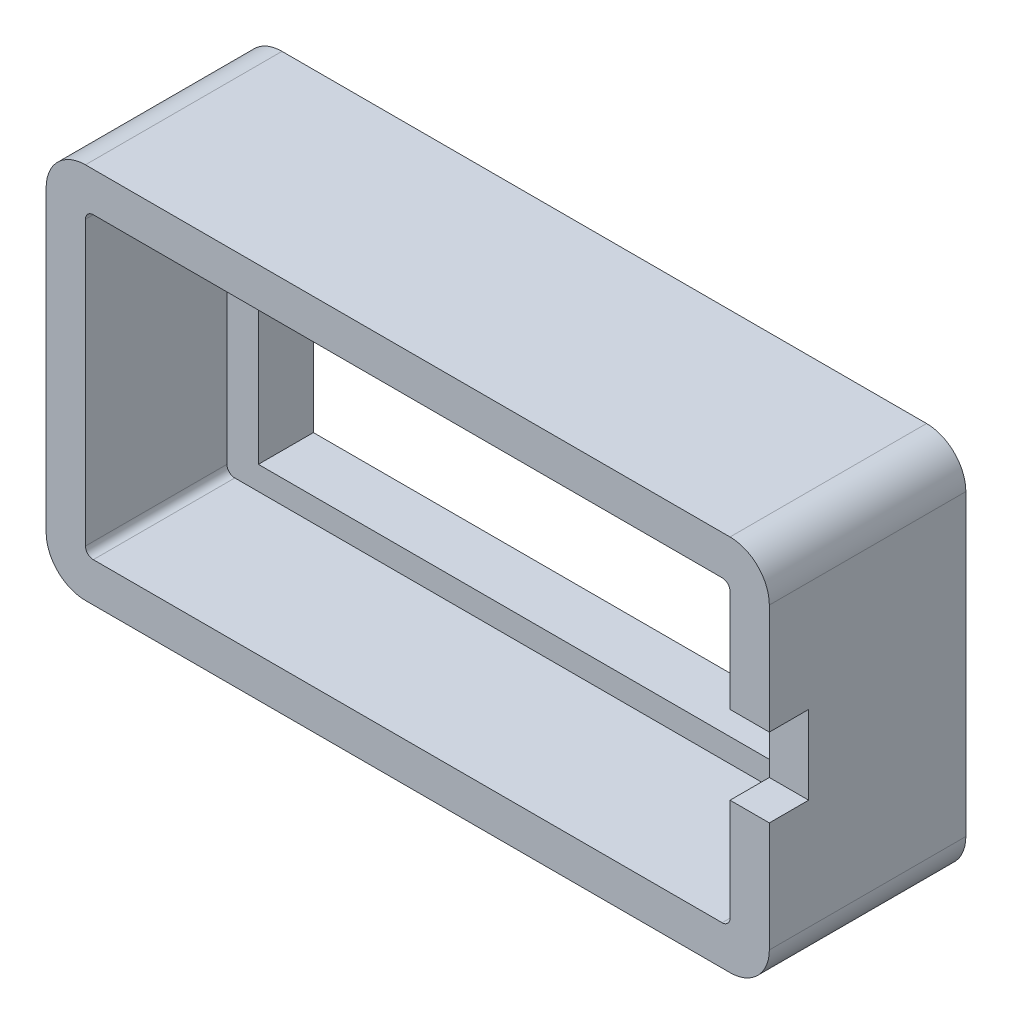
ISO-10303-21;
HEADER;
FILE_DESCRIPTION(('STEP AP214'),'2;1');
FILE_NAME('part.step','',(''),(''),'','','');
FILE_SCHEMA(('AUTOMOTIVE_DESIGN { 1 0 10303 214 1 1 1 1 }'));
ENDSEC;
DATA;
#1=APPLICATION_CONTEXT('core data for automotive mechanical design processes');
#2=APPLICATION_PROTOCOL_DEFINITION('international standard','automotive_design',2000,#1);
#3=PRODUCT_CONTEXT('',#1,'mechanical');
#4=PRODUCT('Part','Part','',(#3));
#5=PRODUCT_RELATED_PRODUCT_CATEGORY('part','',(#4));
#6=PRODUCT_DEFINITION_FORMATION('','',#4);
#7=PRODUCT_DEFINITION_CONTEXT('part definition',#1,'design');
#8=PRODUCT_DEFINITION('design','',#6,#7);
#9=PRODUCT_DEFINITION_SHAPE('','',#8);
#10=(LENGTH_UNIT() NAMED_UNIT(*) SI_UNIT(.MILLI.,.METRE.));
#11=(NAMED_UNIT(*) PLANE_ANGLE_UNIT() SI_UNIT($,.RADIAN.));
#12=(NAMED_UNIT(*) SI_UNIT($,.STERADIAN.) SOLID_ANGLE_UNIT());
#13=UNCERTAINTY_MEASURE_WITH_UNIT(LENGTH_MEASURE(1.E-05),#10,'distance_accuracy_value','');
#14=(GEOMETRIC_REPRESENTATION_CONTEXT(3) GLOBAL_UNCERTAINTY_ASSIGNED_CONTEXT((#13)) GLOBAL_UNIT_ASSIGNED_CONTEXT((#10,
#11,#12)) REPRESENTATION_CONTEXT('',''));
#15=CARTESIAN_POINT('',(0.,0.,0.));
#16=DIRECTION('',(0.,0.,1.));
#17=DIRECTION('',(1.,0.,0.));
#18=AXIS2_PLACEMENT_3D('',#15,#16,#17);
#19=CARTESIAN_POINT('',(0.,0.,25.));
#20=DIRECTION('',(1.,0.,0.));
#21=DIRECTION('',(0.,1.,0.));
#22=AXIS2_PLACEMENT_3D('',#19,#20,#21);
#23=PLANE('',#22);
#24=DIRECTION('',(0.,0.,-1.));
#25=VECTOR('',#24,1.);
#26=CARTESIAN_POINT('',(0.,0.,25.));
#27=LINE('',#26,#25);
#28=CARTESIAN_POINT('',(0.,0.,7.));
#29=VERTEX_POINT('',#28);
#30=CARTESIAN_POINT('',(0.,0.,0.));
#31=VERTEX_POINT('',#30);
#32=EDGE_CURVE('E268',#29,#31,#27,.T.);
#33=ORIENTED_EDGE('',*,*,#32,.F.);
#34=DIRECTION('',(0.,-1.,0.));
#35=VECTOR('',#34,1.);
#36=CARTESIAN_POINT('',(0.,0.,7.));
#37=LINE('',#36,#35);
#38=CARTESIAN_POINT('',(0.,-29.,7.));
#39=VERTEX_POINT('',#38);
#40=EDGE_CURVE('E253',#29,#39,#37,.T.);
#41=ORIENTED_EDGE('',*,*,#40,.T.);
#42=DIRECTION('',(0.,0.,-1.));
#43=VECTOR('',#42,1.);
#44=CARTESIAN_POINT('',(0.,-29.,25.));
#45=LINE('',#44,#43);
#46=CARTESIAN_POINT('',(0.,-29.,0.));
#47=VERTEX_POINT('',#46);
#48=EDGE_CURVE('E274',#39,#47,#45,.T.);
#49=ORIENTED_EDGE('',*,*,#48,.T.);
#50=DIRECTION('',(0.,-1.,0.));
#51=VECTOR('',#50,1.);
#52=CARTESIAN_POINT('',(0.,0.,0.));
#53=LINE('',#52,#51);
#54=EDGE_CURVE('E256',#31,#47,#53,.T.);
#55=ORIENTED_EDGE('',*,*,#54,.F.);
#56=EDGE_LOOP('',(#33,#41,#49,#55));
#57=FACE_BOUND('',#56,.T.);
#58=ADVANCED_FACE('F33',(#57),#23,.T.);
#59=CARTESIAN_POINT('',(0.,-29.,25.));
#60=DIRECTION('',(0.,1.,0.));
#61=DIRECTION('',(0.,0.,1.));
#62=AXIS2_PLACEMENT_3D('',#59,#60,#61);
#63=PLANE('',#62);
#64=ORIENTED_EDGE('',*,*,#48,.F.);
#65=DIRECTION('',(1.,0.,0.));
#66=VECTOR('',#65,1.);
#67=CARTESIAN_POINT('',(0.,-29.,7.));
#68=LINE('',#67,#66);
#69=CARTESIAN_POINT('',(74.,-29.,7.));
#70=VERTEX_POINT('',#69);
#71=EDGE_CURVE('E250',#39,#70,#68,.T.);
#72=ORIENTED_EDGE('',*,*,#71,.T.);
#73=DIRECTION('',(0.,0.,-1.));
#74=VECTOR('',#73,1.);
#75=CARTESIAN_POINT('',(74.,-29.,25.));
#76=LINE('',#75,#74);
#77=CARTESIAN_POINT('',(74.,-29.,0.));
#78=VERTEX_POINT('',#77);
#79=EDGE_CURVE('E272',#70,#78,#76,.T.);
#80=ORIENTED_EDGE('',*,*,#79,.T.);
#81=DIRECTION('',(1.,0.,0.));
#82=VECTOR('',#81,1.);
#83=CARTESIAN_POINT('',(0.,-29.,0.));
#84=LINE('',#83,#82);
#85=EDGE_CURVE('E259',#47,#78,#84,.T.);
#86=ORIENTED_EDGE('',*,*,#85,.F.);
#87=EDGE_LOOP('',(#64,#72,#80,#86));
#88=FACE_BOUND('',#87,.T.);
#89=ADVANCED_FACE('F427',(#88),#63,.T.);
#90=CARTESIAN_POINT('',(74.,0.,25.));
#91=DIRECTION('',(-1.,0.,0.));
#92=DIRECTION('',(0.,0.,1.));
#93=AXIS2_PLACEMENT_3D('',#90,#91,#92);
#94=PLANE('',#93);
#95=ORIENTED_EDGE('',*,*,#79,.F.);
#96=DIRECTION('',(0.,1.,0.));
#97=VECTOR('',#96,1.);
#98=CARTESIAN_POINT('',(74.,0.,7.));
#99=LINE('',#98,#97);
#100=CARTESIAN_POINT('',(74.,0.,7.));
#101=VERTEX_POINT('',#100);
#102=EDGE_CURVE('E237',#70,#101,#99,.T.);
#103=ORIENTED_EDGE('',*,*,#102,.T.);
#104=DIRECTION('',(0.,0.,-1.));
#105=VECTOR('',#104,1.);
#106=CARTESIAN_POINT('',(74.,0.,25.));
#107=LINE('',#106,#105);
#108=CARTESIAN_POINT('',(74.,0.,0.));
#109=VERTEX_POINT('',#108);
#110=EDGE_CURVE('E270',#101,#109,#107,.T.);
#111=ORIENTED_EDGE('',*,*,#110,.T.);
#112=DIRECTION('',(0.,1.,0.));
#113=VECTOR('',#112,1.);
#114=CARTESIAN_POINT('',(74.,0.,0.));
#115=LINE('',#114,#113);
#116=EDGE_CURVE('E262',#78,#109,#115,.T.);
#117=ORIENTED_EDGE('',*,*,#116,.F.);
#118=EDGE_LOOP('',(#95,#103,#111,#117));
#119=FACE_BOUND('',#118,.T.);
#120=ADVANCED_FACE('F433',(#119),#94,.T.);
#121=CARTESIAN_POINT('',(0.,0.,25.));
#122=DIRECTION('',(0.,-1.,0.));
#123=DIRECTION('',(0.,0.,-1.));
#124=AXIS2_PLACEMENT_3D('',#121,#122,#123);
#125=PLANE('',#124);
#126=ORIENTED_EDGE('',*,*,#110,.F.);
#127=DIRECTION('',(-1.,0.,0.));
#128=VECTOR('',#127,1.);
#129=CARTESIAN_POINT('',(0.,0.,7.));
#130=LINE('',#129,#128);
#131=EDGE_CURVE('E290',#101,#29,#130,.T.);
#132=ORIENTED_EDGE('',*,*,#131,.T.);
#133=ORIENTED_EDGE('',*,*,#32,.T.);
#134=DIRECTION('',(-1.,0.,0.));
#135=VECTOR('',#134,1.);
#136=CARTESIAN_POINT('',(0.,0.,0.));
#137=LINE('',#136,#135);
#138=EDGE_CURVE('E265',#109,#31,#137,.T.);
#139=ORIENTED_EDGE('',*,*,#138,.F.);
#140=EDGE_LOOP('',(#126,#132,#133,#139));
#141=FACE_BOUND('',#140,.T.);
#142=ADVANCED_FACE('F441',(#141),#125,.T.);
#143=CARTESIAN_POINT('',(0.,0.,25.));
#144=DIRECTION('',(0.,0.,-1.));
#145=DIRECTION('',(-1.,0.,0.));
#146=AXIS2_PLACEMENT_3D('',#143,#144,#145);
#147=PLANE('',#146);
#148=DIRECTION('',(0.,1.,0.));
#149=VECTOR('',#148,1.);
#150=CARTESIAN_POINT('',(83.,-37.,25.));
#151=LINE('',#150,#149);
#152=CARTESIAN_POINT('',(83.,-32.,25.));
#153=VERTEX_POINT('',#152);
#154=CARTESIAN_POINT('',(83.,-18.,25.));
#155=VERTEX_POINT('',#154);
#156=EDGE_CURVE('E284',#153,#155,#151,.T.);
#157=ORIENTED_EDGE('',*,*,#156,.T.);
#158=DIRECTION('',(-1.,0.,0.));
#159=VECTOR('',#158,1.);
#160=CARTESIAN_POINT('',(0.,-18.,25.));
#161=LINE('',#160,#159);
#162=CARTESIAN_POINT('',(78.,-18.,25.));
#163=VERTEX_POINT('',#162);
#164=EDGE_CURVE('E220',#155,#163,#161,.T.);
#165=ORIENTED_EDGE('',*,*,#164,.T.);
#166=DIRECTION('',(0.,1.,0.));
#167=VECTOR('',#166,1.);
#168=CARTESIAN_POINT('',(78.,6.,25.));
#169=LINE('',#168,#167);
#170=CARTESIAN_POINT('',(78.,-31.,25.));
#171=VERTEX_POINT('',#170);
#172=EDGE_CURVE('E243',#171,#163,#169,.T.);
#173=ORIENTED_EDGE('',*,*,#172,.F.);
#174=CARTESIAN_POINT('',(77.,-31.,25.));
#175=DIRECTION('',(0.,0.,-1.));
#176=DIRECTION('',(-1.,0.,0.));
#177=AXIS2_PLACEMENT_3D('',#174,#175,#176);
#178=CIRCLE('',#177,1.);
#179=CARTESIAN_POINT('',(77.,-32.,25.));
#180=VERTEX_POINT('',#179);
#181=EDGE_CURVE('E373',#171,#180,#178,.T.);
#182=ORIENTED_EDGE('',*,*,#181,.T.);
#183=DIRECTION('',(1.,0.,0.));
#184=VECTOR('',#183,1.);
#185=CARTESIAN_POINT('',(-3.99999999999999,-32.,25.));
#186=LINE('',#185,#184);
#187=CARTESIAN_POINT('',(-2.99999999999999,-32.,25.));
#188=VERTEX_POINT('',#187);
#189=EDGE_CURVE('E240',#188,#180,#186,.T.);
#190=ORIENTED_EDGE('',*,*,#189,.F.);
#191=CARTESIAN_POINT('',(-2.99999999999999,-31.,25.));
#192=DIRECTION('',(0.,0.,-1.));
#193=DIRECTION('',(-1.,0.,0.));
#194=AXIS2_PLACEMENT_3D('',#191,#192,#193);
#195=CIRCLE('',#194,1.);
#196=CARTESIAN_POINT('',(-3.99999999999999,-31.,25.));
#197=VERTEX_POINT('',#196);
#198=EDGE_CURVE('E369',#188,#197,#195,.T.);
#199=ORIENTED_EDGE('',*,*,#198,.T.);
#200=DIRECTION('',(0.,-1.,0.));
#201=VECTOR('',#200,1.);
#202=CARTESIAN_POINT('',(-3.99999999999999,6.,25.));
#203=LINE('',#202,#201);
#204=CARTESIAN_POINT('',(-3.99999999999999,5.,25.));
#205=VERTEX_POINT('',#204);
#206=EDGE_CURVE('E223',#205,#197,#203,.T.);
#207=ORIENTED_EDGE('',*,*,#206,.F.);
#208=CARTESIAN_POINT('',(-2.99999999999999,5.,25.));
#209=DIRECTION('',(0.,0.,-1.));
#210=DIRECTION('',(-1.,0.,0.));
#211=AXIS2_PLACEMENT_3D('',#208,#209,#210);
#212=CIRCLE('',#211,1.);
#213=CARTESIAN_POINT('',(-2.99999999999999,6.,25.));
#214=VERTEX_POINT('',#213);
#215=EDGE_CURVE('E367',#205,#214,#212,.T.);
#216=ORIENTED_EDGE('',*,*,#215,.T.);
#217=DIRECTION('',(-1.,0.,0.));
#218=VECTOR('',#217,1.);
#219=CARTESIAN_POINT('',(-3.99999999999999,6.,25.));
#220=LINE('',#219,#218);
#221=CARTESIAN_POINT('',(77.,6.,25.));
#222=VERTEX_POINT('',#221);
#223=EDGE_CURVE('E228',#222,#214,#220,.T.);
#224=ORIENTED_EDGE('',*,*,#223,.F.);
#225=CARTESIAN_POINT('',(77.,5.,25.));
#226=DIRECTION('',(0.,0.,-1.));
#227=DIRECTION('',(-1.,0.,0.));
#228=AXIS2_PLACEMENT_3D('',#225,#226,#227);
#229=CIRCLE('',#228,1.);
#230=CARTESIAN_POINT('',(78.,5.,25.));
#231=VERTEX_POINT('',#230);
#232=EDGE_CURVE('E371',#222,#231,#229,.T.);
#233=ORIENTED_EDGE('',*,*,#232,.T.);
#234=CARTESIAN_POINT('',(78.,-8.,25.));
#235=VERTEX_POINT('',#234);
#236=EDGE_CURVE('E55',#235,#231,#169,.T.);
#237=ORIENTED_EDGE('',*,*,#236,.F.);
#238=DIRECTION('',(1.,0.,0.));
#239=VECTOR('',#238,1.);
#240=CARTESIAN_POINT('',(0.,-7.99999999999998,25.));
#241=LINE('',#240,#239);
#242=CARTESIAN_POINT('',(83.,-8.,25.));
#243=VERTEX_POINT('',#242);
#244=EDGE_CURVE('E48',#235,#243,#241,.T.);
#245=ORIENTED_EDGE('',*,*,#244,.T.);
#246=CARTESIAN_POINT('',(83.,6.,25.));
#247=VERTEX_POINT('',#246);
#248=EDGE_CURVE('E214',#243,#247,#151,.T.);
#249=ORIENTED_EDGE('',*,*,#248,.T.);
#250=CARTESIAN_POINT('',(78.,6.,25.));
#251=DIRECTION('',(0.,0.,-1.));
#252=DIRECTION('',(-1.,0.,0.));
#253=AXIS2_PLACEMENT_3D('',#250,#251,#252);
#254=CIRCLE('',#253,5.);
#255=CARTESIAN_POINT('',(78.,11.,25.));
#256=VERTEX_POINT('',#255);
#257=EDGE_CURVE('E323',#247,#256,#254,.F.);
#258=ORIENTED_EDGE('',*,*,#257,.T.);
#259=DIRECTION('',(-1.,0.,0.));
#260=VECTOR('',#259,1.);
#261=CARTESIAN_POINT('',(-8.99999999999999,11.,25.));
#262=LINE('',#261,#260);
#263=CARTESIAN_POINT('',(-3.99999999999999,11.,25.));
#264=VERTEX_POINT('',#263);
#265=EDGE_CURVE('E287',#256,#264,#262,.T.);
#266=ORIENTED_EDGE('',*,*,#265,.T.);
#267=CARTESIAN_POINT('',(-3.99999999999999,6.,25.));
#268=DIRECTION('',(0.,0.,-1.));
#269=DIRECTION('',(-1.,0.,0.));
#270=AXIS2_PLACEMENT_3D('',#267,#268,#269);
#271=CIRCLE('',#270,5.);
#272=CARTESIAN_POINT('',(-8.99999999999999,6.,25.));
#273=VERTEX_POINT('',#272);
#274=EDGE_CURVE('E325',#264,#273,#271,.F.);
#275=ORIENTED_EDGE('',*,*,#274,.T.);
#276=DIRECTION('',(0.,-1.,0.));
#277=VECTOR('',#276,1.);
#278=CARTESIAN_POINT('',(-8.99999999999999,-37.,25.));
#279=LINE('',#278,#277);
#280=CARTESIAN_POINT('',(-8.99999999999999,-32.,25.));
#281=VERTEX_POINT('',#280);
#282=EDGE_CURVE('E277',#273,#281,#279,.T.);
#283=ORIENTED_EDGE('',*,*,#282,.T.);
#284=CARTESIAN_POINT('',(-3.99999999999999,-32.,25.));
#285=DIRECTION('',(0.,0.,-1.));
#286=DIRECTION('',(-1.,0.,0.));
#287=AXIS2_PLACEMENT_3D('',#284,#285,#286);
#288=CIRCLE('',#287,5.);
#289=CARTESIAN_POINT('',(-3.99999999999999,-37.,25.));
#290=VERTEX_POINT('',#289);
#291=EDGE_CURVE('E327',#281,#290,#288,.F.);
#292=ORIENTED_EDGE('',*,*,#291,.T.);
#293=DIRECTION('',(1.,0.,0.));
#294=VECTOR('',#293,1.);
#295=CARTESIAN_POINT('',(-8.99999999999999,-37.,25.));
#296=LINE('',#295,#294);
#297=CARTESIAN_POINT('',(78.,-37.,25.));
#298=VERTEX_POINT('',#297);
#299=EDGE_CURVE('E280',#290,#298,#296,.T.);
#300=ORIENTED_EDGE('',*,*,#299,.T.);
#301=CARTESIAN_POINT('',(78.,-32.,25.));
#302=DIRECTION('',(0.,0.,-1.));
#303=DIRECTION('',(-1.,0.,0.));
#304=AXIS2_PLACEMENT_3D('',#301,#302,#303);
#305=CIRCLE('',#304,5.);
#306=EDGE_CURVE('E321',#298,#153,#305,.F.);
#307=ORIENTED_EDGE('',*,*,#306,.T.);
#308=EDGE_LOOP('',(#157,#165,#173,#182,#190,#199,#207,#216,#224,#233,#237,#245,#249,#258,#266,
#275,#283,#292,#300,#307));
#309=FACE_BOUND('',#308,.T.);
#310=ADVANCED_FACE('F381',(#309),#147,.F.);
#311=CARTESIAN_POINT('',(0.,0.,0.));
#312=DIRECTION('',(0.,0.,-1.));
#313=DIRECTION('',(-1.,0.,0.));
#314=AXIS2_PLACEMENT_3D('',#311,#312,#313);
#315=PLANE('',#314);
#316=DIRECTION('',(1.,0.,0.));
#317=VECTOR('',#316,1.);
#318=CARTESIAN_POINT('',(-8.99999999999999,-37.,0.));
#319=LINE('',#318,#317);
#320=CARTESIAN_POINT('',(-3.99999999999999,-37.,0.));
#321=VERTEX_POINT('',#320);
#322=CARTESIAN_POINT('',(78.,-37.,0.));
#323=VERTEX_POINT('',#322);
#324=EDGE_CURVE('E293',#321,#323,#319,.T.);
#325=ORIENTED_EDGE('',*,*,#324,.F.);
#326=CARTESIAN_POINT('',(-3.99999999999999,-32.,0.));
#327=DIRECTION('',(0.,0.,-1.));
#328=DIRECTION('',(-1.,0.,0.));
#329=AXIS2_PLACEMENT_3D('',#326,#327,#328);
#330=CIRCLE('',#329,5.);
#331=CARTESIAN_POINT('',(-8.99999999999999,-32.,0.));
#332=VERTEX_POINT('',#331);
#333=EDGE_CURVE('E314',#321,#332,#330,.T.);
#334=ORIENTED_EDGE('',*,*,#333,.T.);
#335=DIRECTION('',(0.,-1.,0.));
#336=VECTOR('',#335,1.);
#337=CARTESIAN_POINT('',(-8.99999999999999,-37.,0.));
#338=LINE('',#337,#336);
#339=CARTESIAN_POINT('',(-8.99999999999999,6.,0.));
#340=VERTEX_POINT('',#339);
#341=EDGE_CURVE('E276',#340,#332,#338,.T.);
#342=ORIENTED_EDGE('',*,*,#341,.F.);
#343=CARTESIAN_POINT('',(-3.99999999999999,6.,0.));
#344=DIRECTION('',(0.,0.,-1.));
#345=DIRECTION('',(-1.,0.,0.));
#346=AXIS2_PLACEMENT_3D('',#343,#344,#345);
#347=CIRCLE('',#346,5.);
#348=CARTESIAN_POINT('',(-3.99999999999999,11.,0.));
#349=VERTEX_POINT('',#348);
#350=EDGE_CURVE('E312',#340,#349,#347,.T.);
#351=ORIENTED_EDGE('',*,*,#350,.T.);
#352=DIRECTION('',(-1.,0.,0.));
#353=VECTOR('',#352,1.);
#354=CARTESIAN_POINT('',(-8.99999999999999,11.,0.));
#355=LINE('',#354,#353);
#356=CARTESIAN_POINT('',(78.,11.,0.));
#357=VERTEX_POINT('',#356);
#358=EDGE_CURVE('E281',#357,#349,#355,.T.);
#359=ORIENTED_EDGE('',*,*,#358,.F.);
#360=CARTESIAN_POINT('',(78.,6.,0.));
#361=DIRECTION('',(0.,0.,-1.));
#362=DIRECTION('',(-1.,0.,0.));
#363=AXIS2_PLACEMENT_3D('',#360,#361,#362);
#364=CIRCLE('',#363,5.);
#365=CARTESIAN_POINT('',(83.,6.,0.));
#366=VERTEX_POINT('',#365);
#367=EDGE_CURVE('E310',#357,#366,#364,.T.);
#368=ORIENTED_EDGE('',*,*,#367,.T.);
#369=DIRECTION('',(0.,1.,0.));
#370=VECTOR('',#369,1.);
#371=CARTESIAN_POINT('',(83.,-37.,0.));
#372=LINE('',#371,#370);
#373=CARTESIAN_POINT('',(83.,-32.,0.));
#374=VERTEX_POINT('',#373);
#375=EDGE_CURVE('E296',#374,#366,#372,.T.);
#376=ORIENTED_EDGE('',*,*,#375,.F.);
#377=CARTESIAN_POINT('',(78.,-32.,0.));
#378=DIRECTION('',(0.,0.,-1.));
#379=DIRECTION('',(-1.,0.,0.));
#380=AXIS2_PLACEMENT_3D('',#377,#378,#379);
#381=CIRCLE('',#380,5.);
#382=EDGE_CURVE('E308',#374,#323,#381,.T.);
#383=ORIENTED_EDGE('',*,*,#382,.T.);
#384=EDGE_LOOP('',(#325,#334,#342,#351,#359,#368,#376,#383));
#385=FACE_BOUND('',#384,.T.);
#386=ORIENTED_EDGE('',*,*,#138,.T.);
#387=ORIENTED_EDGE('',*,*,#54,.T.);
#388=ORIENTED_EDGE('',*,*,#85,.T.);
#389=ORIENTED_EDGE('',*,*,#116,.T.);
#390=EDGE_LOOP('',(#386,#387,#388,#389));
#391=FACE_BOUND('',#390,.T.);
#392=ADVANCED_FACE('F392',(#385,#391),#315,.T.);
#393=CARTESIAN_POINT('',(-8.99999999999999,-37.,25.));
#394=DIRECTION('',(1.,0.,0.));
#395=DIRECTION('',(0.,0.,-1.));
#396=AXIS2_PLACEMENT_3D('',#393,#394,#395);
#397=PLANE('',#396);
#398=ORIENTED_EDGE('',*,*,#341,.T.);
#399=DIRECTION('',(0.,0.,-1.));
#400=VECTOR('',#399,1.);
#401=CARTESIAN_POINT('',(-8.99999999999999,-32.,25.));
#402=LINE('',#401,#400);
#403=EDGE_CURVE('E319',#332,#281,#402,.F.);
#404=ORIENTED_EDGE('',*,*,#403,.T.);
#405=ORIENTED_EDGE('',*,*,#282,.F.);
#406=DIRECTION('',(0.,0.,-1.));
#407=VECTOR('',#406,1.);
#408=CARTESIAN_POINT('',(-8.99999999999999,6.,25.));
#409=LINE('',#408,#407);
#410=EDGE_CURVE('E316',#273,#340,#409,.T.);
#411=ORIENTED_EDGE('',*,*,#410,.T.);
#412=EDGE_LOOP('',(#398,#404,#405,#411));
#413=FACE_BOUND('',#412,.T.);
#414=ADVANCED_FACE('F410',(#413),#397,.F.);
#415=CARTESIAN_POINT('',(-8.99999999999999,-37.,25.));
#416=DIRECTION('',(0.,1.,0.));
#417=DIRECTION('',(0.,0.,1.));
#418=AXIS2_PLACEMENT_3D('',#415,#416,#417);
#419=PLANE('',#418);
#420=ORIENTED_EDGE('',*,*,#299,.F.);
#421=DIRECTION('',(0.,0.,-1.));
#422=VECTOR('',#421,1.);
#423=CARTESIAN_POINT('',(-3.99999999999999,-37.,25.));
#424=LINE('',#423,#422);
#425=EDGE_CURVE('E305',#290,#321,#424,.T.);
#426=ORIENTED_EDGE('',*,*,#425,.T.);
#427=ORIENTED_EDGE('',*,*,#324,.T.);
#428=DIRECTION('',(0.,0.,-1.));
#429=VECTOR('',#428,1.);
#430=CARTESIAN_POINT('',(78.,-37.,25.));
#431=LINE('',#430,#429);
#432=EDGE_CURVE('E303',#323,#298,#431,.F.);
#433=ORIENTED_EDGE('',*,*,#432,.T.);
#434=EDGE_LOOP('',(#420,#426,#427,#433));
#435=FACE_BOUND('',#434,.T.);
#436=ADVANCED_FACE('F417',(#435),#419,.F.);
#437=CARTESIAN_POINT('',(83.,-37.,25.));
#438=DIRECTION('',(-1.,0.,0.));
#439=DIRECTION('',(0.,-1.,0.));
#440=AXIS2_PLACEMENT_3D('',#437,#438,#439);
#441=PLANE('',#440);
#442=DIRECTION('',(0.,1.,0.));
#443=VECTOR('',#442,1.);
#444=CARTESIAN_POINT('',(83.,-8.,20.));
#445=LINE('',#444,#443);
#446=CARTESIAN_POINT('',(83.,-18.,20.));
#447=VERTEX_POINT('',#446);
#448=CARTESIAN_POINT('',(83.,-8.,20.));
#449=VERTEX_POINT('',#448);
#450=EDGE_CURVE('E204',#447,#449,#445,.T.);
#451=ORIENTED_EDGE('',*,*,#450,.F.);
#452=DIRECTION('',(0.,0.,-1.));
#453=VECTOR('',#452,1.);
#454=CARTESIAN_POINT('',(83.,-18.,30.));
#455=LINE('',#454,#453);
#456=EDGE_CURVE('E201',#155,#447,#455,.T.);
#457=ORIENTED_EDGE('',*,*,#456,.F.);
#458=ORIENTED_EDGE('',*,*,#156,.F.);
#459=DIRECTION('',(0.,0.,-1.));
#460=VECTOR('',#459,1.);
#461=CARTESIAN_POINT('',(83.,-32.,25.));
#462=LINE('',#461,#460);
#463=EDGE_CURVE('E334',#153,#374,#462,.T.);
#464=ORIENTED_EDGE('',*,*,#463,.T.);
#465=ORIENTED_EDGE('',*,*,#375,.T.);
#466=DIRECTION('',(0.,0.,-1.));
#467=VECTOR('',#466,1.);
#468=CARTESIAN_POINT('',(83.,6.,25.));
#469=LINE('',#468,#467);
#470=EDGE_CURVE('E337',#366,#247,#469,.F.);
#471=ORIENTED_EDGE('',*,*,#470,.T.);
#472=ORIENTED_EDGE('',*,*,#248,.F.);
#473=DIRECTION('',(0.,0.,1.));
#474=VECTOR('',#473,1.);
#475=CARTESIAN_POINT('',(83.,-8.,30.));
#476=LINE('',#475,#474);
#477=EDGE_CURVE('E196',#449,#243,#476,.T.);
#478=ORIENTED_EDGE('',*,*,#477,.F.);
#479=EDGE_LOOP('',(#451,#457,#458,#464,#465,#471,#472,#478));
#480=FACE_BOUND('',#479,.T.);
#481=ADVANCED_FACE('F212',(#480),#441,.F.);
#482=CARTESIAN_POINT('',(-8.99999999999999,11.,25.));
#483=DIRECTION('',(0.,-1.,0.));
#484=DIRECTION('',(0.,0.,-1.));
#485=AXIS2_PLACEMENT_3D('',#482,#483,#484);
#486=PLANE('',#485);
#487=ORIENTED_EDGE('',*,*,#358,.T.);
#488=DIRECTION('',(0.,0.,-1.));
#489=VECTOR('',#488,1.);
#490=CARTESIAN_POINT('',(-3.99999999999999,11.,25.));
#491=LINE('',#490,#489);
#492=EDGE_CURVE('E332',#349,#264,#491,.F.);
#493=ORIENTED_EDGE('',*,*,#492,.T.);
#494=ORIENTED_EDGE('',*,*,#265,.F.);
#495=DIRECTION('',(0.,0.,-1.));
#496=VECTOR('',#495,1.);
#497=CARTESIAN_POINT('',(78.,11.,25.));
#498=LINE('',#497,#496);
#499=EDGE_CURVE('E329',#256,#357,#498,.T.);
#500=ORIENTED_EDGE('',*,*,#499,.T.);
#501=EDGE_LOOP('',(#487,#493,#494,#500));
#502=FACE_BOUND('',#501,.T.);
#503=ADVANCED_FACE('F401',(#502),#486,.F.);
#504=CARTESIAN_POINT('',(-3.99999999999999,6.,7.));
#505=DIRECTION('',(-1.,0.,0.));
#506=DIRECTION('',(0.,-1.,0.));
#507=AXIS2_PLACEMENT_3D('',#504,#505,#506);
#508=PLANE('',#507);
#509=DIRECTION('',(0.,-1.,0.));
#510=VECTOR('',#509,1.);
#511=CARTESIAN_POINT('',(-3.99999999999999,6.,7.));
#512=LINE('',#511,#510);
#513=CARTESIAN_POINT('',(-3.99999999999999,5.,7.));
#514=VERTEX_POINT('',#513);
#515=CARTESIAN_POINT('',(-3.99999999999999,-31.,7.));
#516=VERTEX_POINT('',#515);
#517=EDGE_CURVE('E224',#514,#516,#512,.T.);
#518=ORIENTED_EDGE('',*,*,#517,.F.);
#519=DIRECTION('',(0.,0.,1.));
#520=VECTOR('',#519,1.);
#521=CARTESIAN_POINT('',(-3.99999999999999,5.,25.));
#522=LINE('',#521,#520);
#523=EDGE_CURVE('E341',#514,#205,#522,.T.);
#524=ORIENTED_EDGE('',*,*,#523,.T.);
#525=ORIENTED_EDGE('',*,*,#206,.T.);
#526=DIRECTION('',(0.,0.,1.));
#527=VECTOR('',#526,1.);
#528=CARTESIAN_POINT('',(-3.99999999999999,-31.,7.));
#529=LINE('',#528,#527);
#530=EDGE_CURVE('E339',#197,#516,#529,.F.);
#531=ORIENTED_EDGE('',*,*,#530,.T.);
#532=EDGE_LOOP('',(#518,#524,#525,#531));
#533=FACE_BOUND('',#532,.T.);
#534=ADVANCED_FACE('F445',(#533),#508,.F.);
#535=CARTESIAN_POINT('',(-3.99999999999999,6.,7.));
#536=DIRECTION('',(0.,1.,0.));
#537=DIRECTION('',(0.,0.,1.));
#538=AXIS2_PLACEMENT_3D('',#535,#536,#537);
#539=PLANE('',#538);
#540=ORIENTED_EDGE('',*,*,#223,.T.);
#541=DIRECTION('',(0.,0.,1.));
#542=VECTOR('',#541,1.);
#543=CARTESIAN_POINT('',(-2.99999999999999,6.,7.));
#544=LINE('',#543,#542);
#545=CARTESIAN_POINT('',(-2.99999999999999,6.,7.));
#546=VERTEX_POINT('',#545);
#547=EDGE_CURVE('E347',#214,#546,#544,.F.);
#548=ORIENTED_EDGE('',*,*,#547,.T.);
#549=DIRECTION('',(-1.,0.,0.));
#550=VECTOR('',#549,1.);
#551=CARTESIAN_POINT('',(-3.99999999999999,6.,7.));
#552=LINE('',#551,#550);
#553=CARTESIAN_POINT('',(77.,6.,7.));
#554=VERTEX_POINT('',#553);
#555=EDGE_CURVE('E234',#554,#546,#552,.T.);
#556=ORIENTED_EDGE('',*,*,#555,.F.);
#557=DIRECTION('',(0.,0.,1.));
#558=VECTOR('',#557,1.);
#559=CARTESIAN_POINT('',(77.,6.,25.));
#560=LINE('',#559,#558);
#561=EDGE_CURVE('E344',#554,#222,#560,.T.);
#562=ORIENTED_EDGE('',*,*,#561,.T.);
#563=EDGE_LOOP('',(#540,#548,#556,#562));
#564=FACE_BOUND('',#563,.T.);
#565=ADVANCED_FACE('F449',(#564),#539,.F.);
#566=CARTESIAN_POINT('',(78.,6.,7.));
#567=DIRECTION('',(1.,0.,0.));
#568=DIRECTION('',(0.,1.,0.));
#569=AXIS2_PLACEMENT_3D('',#566,#567,#568);
#570=PLANE('',#569);
#571=ORIENTED_EDGE('',*,*,#172,.T.);
#572=DIRECTION('',(0.,0.,-1.));
#573=VECTOR('',#572,1.);
#574=CARTESIAN_POINT('',(78.,-18.,7.));
#575=LINE('',#574,#573);
#576=CARTESIAN_POINT('',(78.,-18.,20.));
#577=VERTEX_POINT('',#576);
#578=EDGE_CURVE('E11',#163,#577,#575,.T.);
#579=ORIENTED_EDGE('',*,*,#578,.T.);
#580=DIRECTION('',(0.,1.,0.));
#581=VECTOR('',#580,1.);
#582=CARTESIAN_POINT('',(78.,5.99999999999999,20.));
#583=LINE('',#582,#581);
#584=CARTESIAN_POINT('',(78.,-8.,20.));
#585=VERTEX_POINT('',#584);
#586=EDGE_CURVE('E41',#577,#585,#583,.T.);
#587=ORIENTED_EDGE('',*,*,#586,.T.);
#588=DIRECTION('',(0.,0.,1.));
#589=VECTOR('',#588,1.);
#590=CARTESIAN_POINT('',(78.,-8.,7.));
#591=LINE('',#590,#589);
#592=EDGE_CURVE('E197',#585,#235,#591,.T.);
#593=ORIENTED_EDGE('',*,*,#592,.T.);
#594=ORIENTED_EDGE('',*,*,#236,.T.);
#595=DIRECTION('',(0.,0.,1.));
#596=VECTOR('',#595,1.);
#597=CARTESIAN_POINT('',(78.,5.,7.));
#598=LINE('',#597,#596);
#599=CARTESIAN_POINT('',(78.,5.,7.));
#600=VERTEX_POINT('',#599);
#601=EDGE_CURVE('E365',#231,#600,#598,.F.);
#602=ORIENTED_EDGE('',*,*,#601,.T.);
#603=DIRECTION('',(0.,1.,0.));
#604=VECTOR('',#603,1.);
#605=CARTESIAN_POINT('',(78.,6.,7.));
#606=LINE('',#605,#604);
#607=CARTESIAN_POINT('',(78.,-31.,7.));
#608=VERTEX_POINT('',#607);
#609=EDGE_CURVE('E231',#608,#600,#606,.T.);
#610=ORIENTED_EDGE('',*,*,#609,.F.);
#611=DIRECTION('',(0.,0.,1.));
#612=VECTOR('',#611,1.);
#613=CARTESIAN_POINT('',(78.,-31.,25.));
#614=LINE('',#613,#612);
#615=EDGE_CURVE('E362',#608,#171,#614,.T.);
#616=ORIENTED_EDGE('',*,*,#615,.T.);
#617=EDGE_LOOP('',(#571,#579,#587,#593,#594,#602,#610,#616));
#618=FACE_BOUND('',#617,.T.);
#619=ADVANCED_FACE('F375',(#618),#570,.F.);
#620=CARTESIAN_POINT('',(-3.99999999999999,-32.,7.));
#621=DIRECTION('',(0.,-1.,0.));
#622=DIRECTION('',(0.,0.,-1.));
#623=AXIS2_PLACEMENT_3D('',#620,#621,#622);
#624=PLANE('',#623);
#625=DIRECTION('',(1.,0.,0.));
#626=VECTOR('',#625,1.);
#627=CARTESIAN_POINT('',(-3.99999999999999,-32.,7.));
#628=LINE('',#627,#626);
#629=CARTESIAN_POINT('',(-2.99999999999999,-32.,7.));
#630=VERTEX_POINT('',#629);
#631=CARTESIAN_POINT('',(77.,-32.,7.));
#632=VERTEX_POINT('',#631);
#633=EDGE_CURVE('E227',#630,#632,#628,.T.);
#634=ORIENTED_EDGE('',*,*,#633,.F.);
#635=DIRECTION('',(0.,0.,1.));
#636=VECTOR('',#635,1.);
#637=CARTESIAN_POINT('',(-2.99999999999999,-32.,25.));
#638=LINE('',#637,#636);
#639=EDGE_CURVE('E359',#630,#188,#638,.T.);
#640=ORIENTED_EDGE('',*,*,#639,.T.);
#641=ORIENTED_EDGE('',*,*,#189,.T.);
#642=DIRECTION('',(0.,0.,1.));
#643=VECTOR('',#642,1.);
#644=CARTESIAN_POINT('',(77.,-32.,7.));
#645=LINE('',#644,#643);
#646=EDGE_CURVE('E357',#180,#632,#645,.F.);
#647=ORIENTED_EDGE('',*,*,#646,.T.);
#648=EDGE_LOOP('',(#634,#640,#641,#647));
#649=FACE_BOUND('',#648,.T.);
#650=ADVANCED_FACE('F460',(#649),#624,.F.);
#651=CARTESIAN_POINT('',(0.,0.,7.));
#652=DIRECTION('',(0.,0.,1.));
#653=DIRECTION('',(1.,0.,0.));
#654=AXIS2_PLACEMENT_3D('',#651,#652,#653);
#655=PLANE('',#654);
#656=ORIENTED_EDGE('',*,*,#131,.F.);
#657=ORIENTED_EDGE('',*,*,#102,.F.);
#658=ORIENTED_EDGE('',*,*,#71,.F.);
#659=ORIENTED_EDGE('',*,*,#40,.F.);
#660=EDGE_LOOP('',(#656,#657,#658,#659));
#661=FACE_BOUND('',#660,.T.);
#662=ORIENTED_EDGE('',*,*,#555,.T.);
#663=CARTESIAN_POINT('',(-2.99999999999999,5.,7.));
#664=DIRECTION('',(0.,0.,1.));
#665=DIRECTION('',(1.,0.,0.));
#666=AXIS2_PLACEMENT_3D('',#663,#664,#665);
#667=CIRCLE('',#666,1.);
#668=EDGE_CURVE('E355',#546,#514,#667,.T.);
#669=ORIENTED_EDGE('',*,*,#668,.T.);
#670=ORIENTED_EDGE('',*,*,#517,.T.);
#671=CARTESIAN_POINT('',(-2.99999999999999,-31.,7.));
#672=DIRECTION('',(0.,0.,1.));
#673=DIRECTION('',(1.,0.,0.));
#674=AXIS2_PLACEMENT_3D('',#671,#672,#673);
#675=CIRCLE('',#674,1.);
#676=EDGE_CURVE('E353',#516,#630,#675,.T.);
#677=ORIENTED_EDGE('',*,*,#676,.T.);
#678=ORIENTED_EDGE('',*,*,#633,.T.);
#679=CARTESIAN_POINT('',(77.,-31.,7.));
#680=DIRECTION('',(0.,0.,1.));
#681=DIRECTION('',(1.,0.,0.));
#682=AXIS2_PLACEMENT_3D('',#679,#680,#681);
#683=CIRCLE('',#682,1.);
#684=EDGE_CURVE('E349',#632,#608,#683,.T.);
#685=ORIENTED_EDGE('',*,*,#684,.T.);
#686=ORIENTED_EDGE('',*,*,#609,.T.);
#687=CARTESIAN_POINT('',(77.,5.,7.));
#688=DIRECTION('',(0.,0.,1.));
#689=DIRECTION('',(1.,0.,0.));
#690=AXIS2_PLACEMENT_3D('',#687,#688,#689);
#691=CIRCLE('',#690,1.);
#692=EDGE_CURVE('E351',#600,#554,#691,.T.);
#693=ORIENTED_EDGE('',*,*,#692,.T.);
#694=EDGE_LOOP('',(#662,#669,#670,#677,#678,#685,#686,#693));
#695=FACE_BOUND('',#694,.T.);
#696=ADVANCED_FACE('F474',(#661,#695),#655,.T.);
#697=CARTESIAN_POINT('',(-3.99999999999999,-32.,25.));
#698=DIRECTION('',(0.,0.,-1.));
#699=DIRECTION('',(-1.,0.,0.));
#700=AXIS2_PLACEMENT_3D('',#697,#698,#699);
#701=CYLINDRICAL_SURFACE('',#700,5.);
#702=ORIENTED_EDGE('',*,*,#291,.F.);
#703=ORIENTED_EDGE('',*,*,#403,.F.);
#704=ORIENTED_EDGE('',*,*,#333,.F.);
#705=ORIENTED_EDGE('',*,*,#425,.F.);
#706=EDGE_LOOP('',(#702,#703,#704,#705));
#707=FACE_BOUND('',#706,.T.);
#708=ADVANCED_FACE('F415',(#707),#701,.T.);
#709=CARTESIAN_POINT('',(-3.99999999999999,6.,25.));
#710=DIRECTION('',(0.,0.,-1.));
#711=DIRECTION('',(-1.,0.,0.));
#712=AXIS2_PLACEMENT_3D('',#709,#710,#711);
#713=CYLINDRICAL_SURFACE('',#712,5.);
#714=ORIENTED_EDGE('',*,*,#274,.F.);
#715=ORIENTED_EDGE('',*,*,#492,.F.);
#716=ORIENTED_EDGE('',*,*,#350,.F.);
#717=ORIENTED_EDGE('',*,*,#410,.F.);
#718=EDGE_LOOP('',(#714,#715,#716,#717));
#719=FACE_BOUND('',#718,.T.);
#720=ADVANCED_FACE('F407',(#719),#713,.T.);
#721=CARTESIAN_POINT('',(78.,6.,25.));
#722=DIRECTION('',(0.,0.,-1.));
#723=DIRECTION('',(-1.,0.,0.));
#724=AXIS2_PLACEMENT_3D('',#721,#722,#723);
#725=CYLINDRICAL_SURFACE('',#724,5.);
#726=ORIENTED_EDGE('',*,*,#257,.F.);
#727=ORIENTED_EDGE('',*,*,#470,.F.);
#728=ORIENTED_EDGE('',*,*,#367,.F.);
#729=ORIENTED_EDGE('',*,*,#499,.F.);
#730=EDGE_LOOP('',(#726,#727,#728,#729));
#731=FACE_BOUND('',#730,.T.);
#732=ADVANCED_FACE('F398',(#731),#725,.T.);
#733=CARTESIAN_POINT('',(78.,-32.,25.));
#734=DIRECTION('',(0.,0.,-1.));
#735=DIRECTION('',(-1.,0.,0.));
#736=AXIS2_PLACEMENT_3D('',#733,#734,#735);
#737=CYLINDRICAL_SURFACE('',#736,5.);
#738=ORIENTED_EDGE('',*,*,#306,.F.);
#739=ORIENTED_EDGE('',*,*,#432,.F.);
#740=ORIENTED_EDGE('',*,*,#382,.F.);
#741=ORIENTED_EDGE('',*,*,#463,.F.);
#742=EDGE_LOOP('',(#738,#739,#740,#741));
#743=FACE_BOUND('',#742,.T.);
#744=ADVANCED_FACE('F387',(#743),#737,.T.);
#745=CARTESIAN_POINT('',(-2.99999999999999,5.,7.));
#746=DIRECTION('',(0.,0.,-1.));
#747=DIRECTION('',(-1.,0.,0.));
#748=AXIS2_PLACEMENT_3D('',#745,#746,#747);
#749=CYLINDRICAL_SURFACE('',#748,1.);
#750=ORIENTED_EDGE('',*,*,#668,.F.);
#751=ORIENTED_EDGE('',*,*,#547,.F.);
#752=ORIENTED_EDGE('',*,*,#215,.F.);
#753=ORIENTED_EDGE('',*,*,#523,.F.);
#754=EDGE_LOOP('',(#750,#751,#752,#753));
#755=FACE_BOUND('',#754,.T.);
#756=ADVANCED_FACE('F487',(#755),#749,.F.);
#757=CARTESIAN_POINT('',(-2.99999999999999,-31.,7.));
#758=DIRECTION('',(0.,0.,-1.));
#759=DIRECTION('',(-1.,0.,0.));
#760=AXIS2_PLACEMENT_3D('',#757,#758,#759);
#761=CYLINDRICAL_SURFACE('',#760,1.);
#762=ORIENTED_EDGE('',*,*,#676,.F.);
#763=ORIENTED_EDGE('',*,*,#530,.F.);
#764=ORIENTED_EDGE('',*,*,#198,.F.);
#765=ORIENTED_EDGE('',*,*,#639,.F.);
#766=EDGE_LOOP('',(#762,#763,#764,#765));
#767=FACE_BOUND('',#766,.T.);
#768=ADVANCED_FACE('F495',(#767),#761,.F.);
#769=CARTESIAN_POINT('',(77.,5.,7.));
#770=DIRECTION('',(0.,0.,-1.));
#771=DIRECTION('',(-1.,0.,0.));
#772=AXIS2_PLACEMENT_3D('',#769,#770,#771);
#773=CYLINDRICAL_SURFACE('',#772,1.);
#774=ORIENTED_EDGE('',*,*,#692,.F.);
#775=ORIENTED_EDGE('',*,*,#601,.F.);
#776=ORIENTED_EDGE('',*,*,#232,.F.);
#777=ORIENTED_EDGE('',*,*,#561,.F.);
#778=EDGE_LOOP('',(#774,#775,#776,#777));
#779=FACE_BOUND('',#778,.T.);
#780=ADVANCED_FACE('F505',(#779),#773,.F.);
#781=CARTESIAN_POINT('',(77.,-31.,7.));
#782=DIRECTION('',(0.,0.,-1.));
#783=DIRECTION('',(-1.,0.,0.));
#784=AXIS2_PLACEMENT_3D('',#781,#782,#783);
#785=CYLINDRICAL_SURFACE('',#784,1.);
#786=ORIENTED_EDGE('',*,*,#684,.F.);
#787=ORIENTED_EDGE('',*,*,#646,.F.);
#788=ORIENTED_EDGE('',*,*,#181,.F.);
#789=ORIENTED_EDGE('',*,*,#615,.F.);
#790=EDGE_LOOP('',(#786,#787,#788,#789));
#791=FACE_BOUND('',#790,.T.);
#792=ADVANCED_FACE('F35',(#791),#785,.F.);
#793=CARTESIAN_POINT('',(63.,-8.,20.));
#794=DIRECTION('',(0.,0.,-1.));
#795=DIRECTION('',(0.,1.,0.));
#796=AXIS2_PLACEMENT_3D('',#793,#794,#795);
#797=PLANE('',#796);
#798=DIRECTION('',(1.,0.,0.));
#799=VECTOR('',#798,1.);
#800=CARTESIAN_POINT('',(63.,-18.,20.));
#801=LINE('',#800,#799);
#802=EDGE_CURVE('E200',#577,#447,#801,.T.);
#803=ORIENTED_EDGE('',*,*,#802,.T.);
#804=ORIENTED_EDGE('',*,*,#450,.T.);
#805=DIRECTION('',(1.,0.,0.));
#806=VECTOR('',#805,1.);
#807=CARTESIAN_POINT('',(63.,-8.,20.));
#808=LINE('',#807,#806);
#809=EDGE_CURVE('E192',#585,#449,#808,.T.);
#810=ORIENTED_EDGE('',*,*,#809,.F.);
#811=ORIENTED_EDGE('',*,*,#586,.F.);
#812=EDGE_LOOP('',(#803,#804,#810,#811));
#813=FACE_BOUND('',#812,.T.);
#814=ADVANCED_FACE('F205',(#813),#797,.F.);
#815=CARTESIAN_POINT('',(63.,-18.,30.));
#816=DIRECTION('',(0.,-1.,0.));
#817=DIRECTION('',(1.,0.,0.));
#818=AXIS2_PLACEMENT_3D('',#815,#816,#817);
#819=PLANE('',#818);
#820=ORIENTED_EDGE('',*,*,#456,.T.);
#821=ORIENTED_EDGE('',*,*,#802,.F.);
#822=ORIENTED_EDGE('',*,*,#578,.F.);
#823=ORIENTED_EDGE('',*,*,#164,.F.);
#824=EDGE_LOOP('',(#820,#821,#822,#823));
#825=FACE_BOUND('',#824,.T.);
#826=ADVANCED_FACE('F377',(#825),#819,.F.);
#827=CARTESIAN_POINT('',(63.,-8.,30.));
#828=DIRECTION('',(0.,1.,0.));
#829=DIRECTION('',(-1.,0.,0.));
#830=AXIS2_PLACEMENT_3D('',#827,#828,#829);
#831=PLANE('',#830);
#832=ORIENTED_EDGE('',*,*,#592,.F.);
#833=ORIENTED_EDGE('',*,*,#809,.T.);
#834=ORIENTED_EDGE('',*,*,#477,.T.);
#835=ORIENTED_EDGE('',*,*,#244,.F.);
#836=EDGE_LOOP('',(#832,#833,#834,#835));
#837=FACE_BOUND('',#836,.T.);
#838=ADVANCED_FACE('F194',(#837),#831,.F.);
#839=CLOSED_SHELL('',(#58,#89,#120,#142,#310,#392,#414,#436,#481,#503,#534,#565,#619,#650,#696,
#708,#720,#732,#744,#756,#768,#780,#792,#814,#826,#838));
#840=MANIFOLD_SOLID_BREP('B2',#839);
#841=ADVANCED_BREP_SHAPE_REPRESENTATION('',(#18,#840),#14);
#842=SHAPE_DEFINITION_REPRESENTATION(#9,#841);
ENDSEC;
END-ISO-10303-21;
